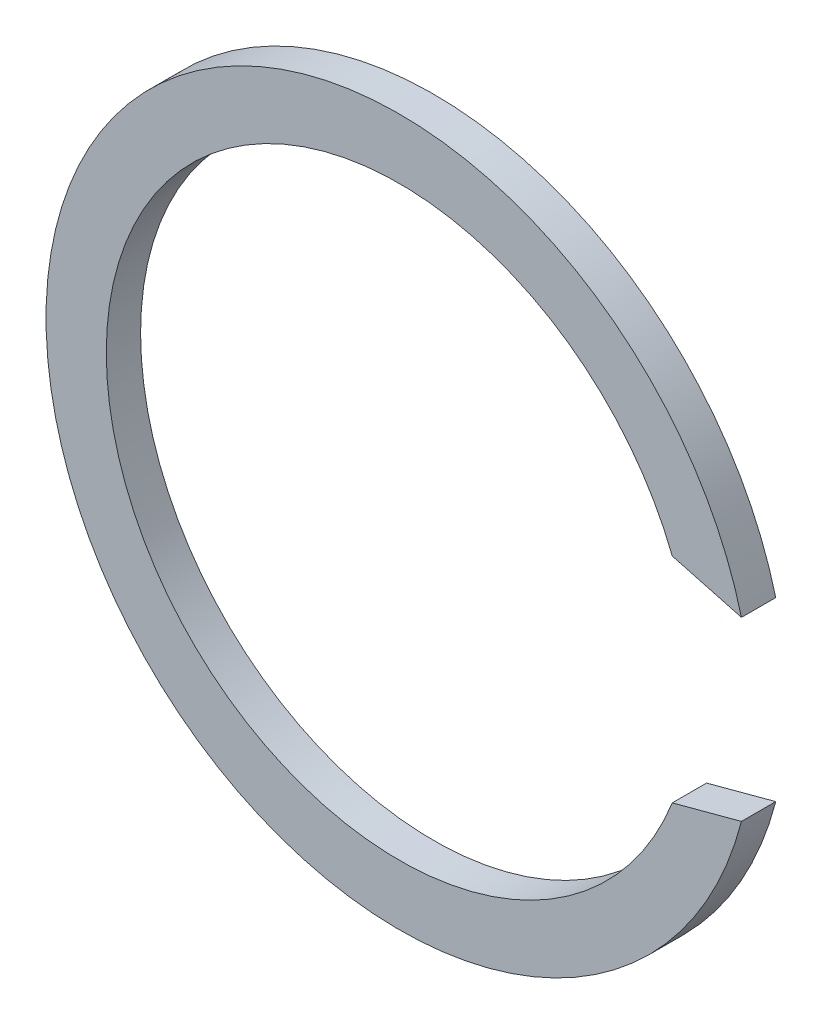
ISO-10303-21;
HEADER;
FILE_DESCRIPTION(('STEP AP214'),'2;1');
FILE_NAME('part.step','',(''),(''),'','','');
FILE_SCHEMA(('AUTOMOTIVE_DESIGN { 1 0 10303 214 1 1 1 1 }'));
ENDSEC;
DATA;
#1=APPLICATION_CONTEXT('core data for automotive mechanical design processes');
#2=APPLICATION_PROTOCOL_DEFINITION('international standard','automotive_design',2000,#1);
#3=PRODUCT_CONTEXT('',#1,'mechanical');
#4=PRODUCT('Part','Part','',(#3));
#5=PRODUCT_RELATED_PRODUCT_CATEGORY('part','',(#4));
#6=PRODUCT_DEFINITION_FORMATION('','',#4);
#7=PRODUCT_DEFINITION_CONTEXT('part definition',#1,'design');
#8=PRODUCT_DEFINITION('design','',#6,#7);
#9=PRODUCT_DEFINITION_SHAPE('','',#8);
#10=(LENGTH_UNIT() NAMED_UNIT(*) SI_UNIT(.MILLI.,.METRE.));
#11=(NAMED_UNIT(*) PLANE_ANGLE_UNIT() SI_UNIT($,.RADIAN.));
#12=(NAMED_UNIT(*) SI_UNIT($,.STERADIAN.) SOLID_ANGLE_UNIT());
#13=UNCERTAINTY_MEASURE_WITH_UNIT(LENGTH_MEASURE(1.E-05),#10,'distance_accuracy_value','');
#14=(GEOMETRIC_REPRESENTATION_CONTEXT(3) GLOBAL_UNCERTAINTY_ASSIGNED_CONTEXT((#13)) GLOBAL_UNIT_ASSIGNED_CONTEXT((#10,
#11,#12)) REPRESENTATION_CONTEXT('',''));
#15=CARTESIAN_POINT('',(0.,0.,0.));
#16=DIRECTION('',(0.,0.,1.));
#17=DIRECTION('',(1.,0.,0.));
#18=AXIS2_PLACEMENT_3D('',#15,#16,#17);
#19=CARTESIAN_POINT('',(0.,0.,0.94));
#20=DIRECTION('',(0.,0.,1.));
#21=DIRECTION('',(1.,0.,0.));
#22=AXIS2_PLACEMENT_3D('',#19,#20,#21);
#23=PLANE('',#22);
#24=CARTESIAN_POINT('',(0.,0.,0.94));
#25=DIRECTION('',(0.,0.,-1.));
#26=DIRECTION('',(-1.,0.,0.));
#27=AXIS2_PLACEMENT_3D('',#24,#25,#26);
#28=CIRCLE('',#27,8.03);
#29=CARTESIAN_POINT('',(7.47719411671023,-2.92787775377216,0.94));
#30=VERTEX_POINT('',#29);
#31=CARTESIAN_POINT('',(7.47719411671023,2.92787775377216,0.94));
#32=VERTEX_POINT('',#31);
#33=EDGE_CURVE('E20',#30,#32,#28,.T.);
#34=ORIENTED_EDGE('',*,*,#33,.T.);
#35=DIRECTION('',(-0.96592582628907,0.258819045102514,0.));
#36=VECTOR('',#35,1.);
#37=CARTESIAN_POINT('',(9.37261969782195,2.42,0.94));
#38=LINE('',#37,#36);
#39=CARTESIAN_POINT('',(9.37261969782195,2.42,0.94));
#40=VERTEX_POINT('',#39);
#41=EDGE_CURVE('E63',#32,#40,#38,.F.);
#42=ORIENTED_EDGE('',*,*,#41,.T.);
#43=CARTESIAN_POINT('',(0.,0.,0.94));
#44=DIRECTION('',(0.,0.,-1.));
#45=DIRECTION('',(-1.,0.,0.));
#46=AXIS2_PLACEMENT_3D('',#43,#44,#45);
#47=CIRCLE('',#46,9.68);
#48=CARTESIAN_POINT('',(9.37261969782195,-2.42,0.94));
#49=VERTEX_POINT('',#48);
#50=EDGE_CURVE('E56',#49,#40,#47,.T.);
#51=ORIENTED_EDGE('',*,*,#50,.F.);
#52=DIRECTION('',(0.96592582628907,0.258819045102514,0.));
#53=VECTOR('',#52,1.);
#54=CARTESIAN_POINT('',(9.37261969782195,-2.42,0.94));
#55=LINE('',#54,#53);
#56=EDGE_CURVE('E61',#49,#30,#55,.F.);
#57=ORIENTED_EDGE('',*,*,#56,.T.);
#58=EDGE_LOOP('',(#34,#42,#51,#57));
#59=FACE_BOUND('',#58,.T.);
#60=ADVANCED_FACE('F17',(#59),#23,.T.);
#61=CARTESIAN_POINT('',(9.37261969782195,-2.42,0.94));
#62=DIRECTION('',(0.258819045102514,-0.96592582628907,0.));
#63=DIRECTION('',(0.96592582628907,0.258819045102514,0.));
#64=AXIS2_PLACEMENT_3D('',#61,#62,#63);
#65=PLANE('',#64);
#66=DIRECTION('',(0.,0.,-1.));
#67=VECTOR('',#66,1.);
#68=CARTESIAN_POINT('',(7.47719411671023,-2.92787775377216,0.94));
#69=LINE('',#68,#67);
#70=CARTESIAN_POINT('',(7.47719411671023,-2.92787775377216,0.));
#71=VERTEX_POINT('',#70);
#72=EDGE_CURVE('E73',#71,#30,#69,.F.);
#73=ORIENTED_EDGE('',*,*,#72,.T.);
#74=ORIENTED_EDGE('',*,*,#56,.F.);
#75=DIRECTION('',(0.,0.,1.));
#76=VECTOR('',#75,1.);
#77=CARTESIAN_POINT('',(9.37261969782195,-2.42,0.94));
#78=LINE('',#77,#76);
#79=CARTESIAN_POINT('',(9.37261969782195,-2.42,0.));
#80=VERTEX_POINT('',#79);
#81=EDGE_CURVE('E71',#80,#49,#78,.T.);
#82=ORIENTED_EDGE('',*,*,#81,.F.);
#83=DIRECTION('',(-0.96592582628907,-0.258819045102515,0.));
#84=VECTOR('',#83,1.);
#85=CARTESIAN_POINT('',(9.37261969782195,-2.42,0.));
#86=LINE('',#85,#84);
#87=EDGE_CURVE('E84',#80,#71,#86,.T.);
#88=ORIENTED_EDGE('',*,*,#87,.T.);
#89=EDGE_LOOP('',(#73,#74,#82,#88));
#90=FACE_BOUND('',#89,.T.);
#91=ADVANCED_FACE('F69',(#90),#65,.F.);
#92=CARTESIAN_POINT('',(0.,0.,0.94));
#93=DIRECTION('',(0.,0.,-1.));
#94=DIRECTION('',(-1.,0.,0.));
#95=AXIS2_PLACEMENT_3D('',#92,#93,#94);
#96=CYLINDRICAL_SURFACE('',#95,8.03);
#97=ORIENTED_EDGE('',*,*,#33,.F.);
#98=ORIENTED_EDGE('',*,*,#72,.F.);
#99=CARTESIAN_POINT('',(0.,0.,0.));
#100=DIRECTION('',(0.,0.,-1.));
#101=DIRECTION('',(-1.,0.,0.));
#102=AXIS2_PLACEMENT_3D('',#99,#100,#101);
#103=CIRCLE('',#102,8.03);
#104=CARTESIAN_POINT('',(7.47719411671023,2.92787775377216,0.));
#105=VERTEX_POINT('',#104);
#106=EDGE_CURVE('E27',#71,#105,#103,.T.);
#107=ORIENTED_EDGE('',*,*,#106,.T.);
#108=DIRECTION('',(0.,0.,1.));
#109=VECTOR('',#108,1.);
#110=CARTESIAN_POINT('',(7.47719411671023,2.92787775377216,0.94));
#111=LINE('',#110,#109);
#112=EDGE_CURVE('E79',#105,#32,#111,.T.);
#113=ORIENTED_EDGE('',*,*,#112,.T.);
#114=EDGE_LOOP('',(#97,#98,#107,#113));
#115=FACE_BOUND('',#114,.T.);
#116=ADVANCED_FACE('F93',(#115),#96,.F.);
#117=CARTESIAN_POINT('',(9.37261969782195,2.42,0.94));
#118=DIRECTION('',(0.258819045102514,0.96592582628907,0.));
#119=DIRECTION('',(-0.96592582628907,0.258819045102514,0.));
#120=AXIS2_PLACEMENT_3D('',#117,#118,#119);
#121=PLANE('',#120);
#122=DIRECTION('',(0.,0.,-1.));
#123=VECTOR('',#122,1.);
#124=CARTESIAN_POINT('',(9.37261969782195,2.42,0.94));
#125=LINE('',#124,#123);
#126=CARTESIAN_POINT('',(9.37261969782195,2.42,0.));
#127=VERTEX_POINT('',#126);
#128=EDGE_CURVE('E68',#40,#127,#125,.T.);
#129=ORIENTED_EDGE('',*,*,#128,.F.);
#130=ORIENTED_EDGE('',*,*,#41,.F.);
#131=ORIENTED_EDGE('',*,*,#112,.F.);
#132=DIRECTION('',(0.96592582628907,-0.258819045102514,0.));
#133=VECTOR('',#132,1.);
#134=CARTESIAN_POINT('',(7.47719411671023,2.92787775377216,0.));
#135=LINE('',#134,#133);
#136=EDGE_CURVE('E11',#105,#127,#135,.T.);
#137=ORIENTED_EDGE('',*,*,#136,.T.);
#138=EDGE_LOOP('',(#129,#130,#131,#137));
#139=FACE_BOUND('',#138,.T.);
#140=ADVANCED_FACE('F86',(#139),#121,.F.);
#141=CARTESIAN_POINT('',(0.,0.,0.94));
#142=DIRECTION('',(0.,0.,-1.));
#143=DIRECTION('',(-1.,0.,0.));
#144=AXIS2_PLACEMENT_3D('',#141,#142,#143);
#145=CYLINDRICAL_SURFACE('',#144,9.68);
#146=ORIENTED_EDGE('',*,*,#128,.T.);
#147=CARTESIAN_POINT('',(0.,0.,0.));
#148=DIRECTION('',(0.,0.,-1.));
#149=DIRECTION('',(-1.,0.,0.));
#150=AXIS2_PLACEMENT_3D('',#147,#148,#149);
#151=CIRCLE('',#150,9.68);
#152=EDGE_CURVE('E34',#127,#80,#151,.F.);
#153=ORIENTED_EDGE('',*,*,#152,.T.);
#154=ORIENTED_EDGE('',*,*,#81,.T.);
#155=ORIENTED_EDGE('',*,*,#50,.T.);
#156=EDGE_LOOP('',(#146,#153,#154,#155));
#157=FACE_BOUND('',#156,.T.);
#158=ADVANCED_FACE('F74',(#157),#145,.T.);
#159=CARTESIAN_POINT('',(0.,0.,0.));
#160=DIRECTION('',(0.,0.,1.));
#161=DIRECTION('',(1.,0.,0.));
#162=AXIS2_PLACEMENT_3D('',#159,#160,#161);
#163=PLANE('',#162);
#164=ORIENTED_EDGE('',*,*,#136,.F.);
#165=ORIENTED_EDGE('',*,*,#106,.F.);
#166=ORIENTED_EDGE('',*,*,#87,.F.);
#167=ORIENTED_EDGE('',*,*,#152,.F.);
#168=EDGE_LOOP('',(#164,#165,#166,#167));
#169=FACE_BOUND('',#168,.T.);
#170=ADVANCED_FACE('F89',(#169),#163,.F.);
#171=CLOSED_SHELL('',(#60,#91,#116,#140,#158,#170));
#172=MANIFOLD_SOLID_BREP('B1',#171);
#173=ADVANCED_BREP_SHAPE_REPRESENTATION('',(#18,#172),#14);
#174=SHAPE_DEFINITION_REPRESENTATION(#9,#173);
ENDSEC;
END-ISO-10303-21;
